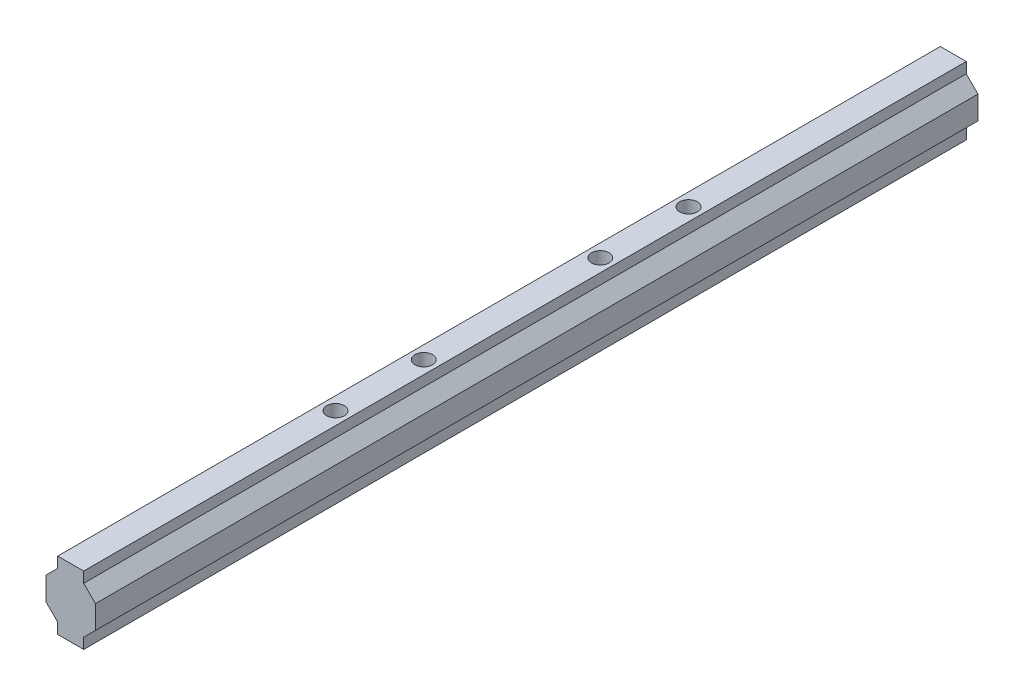
ISO-10303-21;
HEADER;
FILE_DESCRIPTION(('STEP AP214'),'2;1');
FILE_NAME('part.step','',(''),(''),'','','');
FILE_SCHEMA(('AUTOMOTIVE_DESIGN { 1 0 10303 214 1 1 1 1 }'));
ENDSEC;
DATA;
#1=APPLICATION_CONTEXT('core data for automotive mechanical design processes');
#2=APPLICATION_PROTOCOL_DEFINITION('international standard','automotive_design',2000,#1);
#3=PRODUCT_CONTEXT('',#1,'mechanical');
#4=PRODUCT('Part','Part','',(#3));
#5=PRODUCT_RELATED_PRODUCT_CATEGORY('part','',(#4));
#6=PRODUCT_DEFINITION_FORMATION('','',#4);
#7=PRODUCT_DEFINITION_CONTEXT('part definition',#1,'design');
#8=PRODUCT_DEFINITION('design','',#6,#7);
#9=PRODUCT_DEFINITION_SHAPE('','',#8);
#10=(LENGTH_UNIT() NAMED_UNIT(*) SI_UNIT(.MILLI.,.METRE.));
#11=(NAMED_UNIT(*) PLANE_ANGLE_UNIT() SI_UNIT($,.RADIAN.));
#12=(NAMED_UNIT(*) SI_UNIT($,.STERADIAN.) SOLID_ANGLE_UNIT());
#13=UNCERTAINTY_MEASURE_WITH_UNIT(LENGTH_MEASURE(1.E-05),#10,'distance_accuracy_value','');
#14=(GEOMETRIC_REPRESENTATION_CONTEXT(3) GLOBAL_UNCERTAINTY_ASSIGNED_CONTEXT((#13)) GLOBAL_UNIT_ASSIGNED_CONTEXT((#10,
#11,#12)) REPRESENTATION_CONTEXT('',''));
#15=CARTESIAN_POINT('',(0.,0.,0.));
#16=DIRECTION('',(0.,0.,1.));
#17=DIRECTION('',(1.,0.,0.));
#18=AXIS2_PLACEMENT_3D('',#15,#16,#17);
#19=CARTESIAN_POINT('',(-39.550290087148,0.0297695452971111,316.106580091162));
#20=DIRECTION('',(1.,0.,0.));
#21=DIRECTION('',(0.,0.,-1.));
#22=AXIS2_PLACEMENT_3D('',#19,#20,#21);
#23=PLANE('',#22);
#24=DIRECTION('',(0.,-1.,0.));
#25=VECTOR('',#24,1.);
#26=CARTESIAN_POINT('',(-39.550290087148,0.0297695452971111,116.106580091162));
#27=LINE('',#26,#25);
#28=CARTESIAN_POINT('',(-39.550290087148,5.29423563936438,116.106580091162));
#29=VERTEX_POINT('',#28);
#30=CARTESIAN_POINT('',(-39.550290087148,0.0297695452971111,116.106580091162));
#31=VERTEX_POINT('',#30);
#32=EDGE_CURVE('E155',#29,#31,#27,.T.);
#33=ORIENTED_EDGE('',*,*,#32,.T.);
#34=DIRECTION('',(0.,0.,-1.));
#35=VECTOR('',#34,1.);
#36=CARTESIAN_POINT('',(-39.550290087148,0.0297695452971111,316.106580091162));
#37=LINE('',#36,#35);
#38=CARTESIAN_POINT('',(-39.550290087148,0.0297695452971111,316.106580091162));
#39=VERTEX_POINT('',#38);
#40=EDGE_CURVE('E11',#39,#31,#37,.T.);
#41=ORIENTED_EDGE('',*,*,#40,.F.);
#42=DIRECTION('',(0.,-1.,0.));
#43=VECTOR('',#42,1.);
#44=CARTESIAN_POINT('',(-39.550290087148,0.0297695452971111,316.106580091162));
#45=LINE('',#44,#43);
#46=CARTESIAN_POINT('',(-39.550290087148,5.29423563936438,316.106580091162));
#47=VERTEX_POINT('',#46);
#48=EDGE_CURVE('E177',#47,#39,#45,.T.);
#49=ORIENTED_EDGE('',*,*,#48,.F.);
#50=DIRECTION('',(0.,0.,-1.));
#51=VECTOR('',#50,1.);
#52=CARTESIAN_POINT('',(-39.550290087148,5.29423563936438,316.106580091162));
#53=LINE('',#52,#51);
#54=EDGE_CURVE('E151',#47,#29,#53,.T.);
#55=ORIENTED_EDGE('',*,*,#54,.T.);
#56=EDGE_LOOP('',(#33,#41,#49,#55));
#57=FACE_BOUND('',#56,.T.);
#58=ADVANCED_FACE('F33',(#57),#23,.F.);
#59=CARTESIAN_POINT('',(-36.8896299153682,-2.63089062648271,316.106580091162));
#60=DIRECTION('',(0.707106781186547,0.707106781186547,0.));
#61=DIRECTION('',(-0.707106781186548,0.707106781186548,0.));
#62=AXIS2_PLACEMENT_3D('',#59,#60,#61);
#63=PLANE('',#62);
#64=DIRECTION('',(0.707106781186547,-0.707106781186547,0.));
#65=VECTOR('',#64,1.);
#66=CARTESIAN_POINT('',(-36.8896299153682,-2.63089062648271,116.106580091162));
#67=LINE('',#66,#65);
#68=CARTESIAN_POINT('',(-36.8896299153682,-2.63089062648271,116.106580091162));
#69=VERTEX_POINT('',#68);
#70=EDGE_CURVE('E158',#31,#69,#67,.T.);
#71=ORIENTED_EDGE('',*,*,#70,.T.);
#72=DIRECTION('',(0.,0.,-1.));
#73=VECTOR('',#72,1.);
#74=CARTESIAN_POINT('',(-36.8896299153682,-2.63089062648271,316.106580091162));
#75=LINE('',#74,#73);
#76=CARTESIAN_POINT('',(-36.8896299153682,-2.63089062648271,316.106580091162));
#77=VERTEX_POINT('',#76);
#78=EDGE_CURVE('E42',#77,#69,#75,.T.);
#79=ORIENTED_EDGE('',*,*,#78,.F.);
#80=DIRECTION('',(0.707106781186547,-0.707106781186547,0.));
#81=VECTOR('',#80,1.);
#82=CARTESIAN_POINT('',(-36.8896299153682,-2.63089062648271,316.106580091162));
#83=LINE('',#82,#81);
#84=EDGE_CURVE('E106',#39,#77,#83,.T.);
#85=ORIENTED_EDGE('',*,*,#84,.F.);
#86=ORIENTED_EDGE('',*,*,#40,.T.);
#87=EDGE_LOOP('',(#71,#79,#85,#86));
#88=FACE_BOUND('',#87,.T.);
#89=ADVANCED_FACE('F228',(#88),#63,.F.);
#90=CARTESIAN_POINT('',(-36.8896299153682,-5.03799740766926,316.106580091162));
#91=DIRECTION('',(1.,0.,0.));
#92=DIRECTION('',(0.,0.,-1.));
#93=AXIS2_PLACEMENT_3D('',#90,#91,#92);
#94=PLANE('',#93);
#95=DIRECTION('',(0.,-1.,0.));
#96=VECTOR('',#95,1.);
#97=CARTESIAN_POINT('',(-36.8896299153682,-5.03799740766926,116.106580091162));
#98=LINE('',#97,#96);
#99=CARTESIAN_POINT('',(-36.8896299153682,-5.03799740766926,116.106580091162));
#100=VERTEX_POINT('',#99);
#101=EDGE_CURVE('E160',#69,#100,#98,.T.);
#102=ORIENTED_EDGE('',*,*,#101,.T.);
#103=DIRECTION('',(0.,0.,-1.));
#104=VECTOR('',#103,1.);
#105=CARTESIAN_POINT('',(-36.8896299153682,-5.03799740766926,316.106580091162));
#106=LINE('',#105,#104);
#107=CARTESIAN_POINT('',(-36.8896299153682,-5.03799740766926,316.106580091162));
#108=VERTEX_POINT('',#107);
#109=EDGE_CURVE('E196',#108,#100,#106,.T.);
#110=ORIENTED_EDGE('',*,*,#109,.F.);
#111=DIRECTION('',(0.,-1.,0.));
#112=VECTOR('',#111,1.);
#113=CARTESIAN_POINT('',(-36.8896299153682,-5.03799740766926,316.106580091162));
#114=LINE('',#113,#112);
#115=EDGE_CURVE('E244',#77,#108,#114,.T.);
#116=ORIENTED_EDGE('',*,*,#115,.F.);
#117=ORIENTED_EDGE('',*,*,#78,.T.);
#118=EDGE_LOOP('',(#102,#110,#116,#117));
#119=FACE_BOUND('',#118,.T.);
#120=ADVANCED_FACE('F233',(#119),#94,.F.);
#121=CARTESIAN_POINT('',(-31.0109502589278,-5.03799740766925,316.106580091162));
#122=DIRECTION('',(0.,1.,0.));
#123=DIRECTION('',(-1.,0.,0.));
#124=AXIS2_PLACEMENT_3D('',#121,#122,#123);
#125=PLANE('',#124);
#126=CARTESIAN_POINT('',(-33.950290087148,-5.03799740766926,176.106580091162));
#127=DIRECTION('',(0.,-1.,0.));
#128=DIRECTION('',(1.,0.,0.));
#129=AXIS2_PLACEMENT_3D('',#126,#127,#128);
#130=CIRCLE('',#129,2.);
#131=CARTESIAN_POINT('',(-31.950290087148,-5.03799740766926,176.106580091162));
#132=VERTEX_POINT('',#131);
#133=EDGE_CURVE('E205',#132,#132,#130,.T.);
#134=ORIENTED_EDGE('',*,*,#133,.F.);
#135=EDGE_LOOP('',(#134));
#136=FACE_BOUND('',#135,.T.);
#137=CARTESIAN_POINT('',(-33.950290087148,-5.03799740766926,196.106580091162));
#138=DIRECTION('',(0.,-1.,0.));
#139=DIRECTION('',(1.,0.,0.));
#140=AXIS2_PLACEMENT_3D('',#137,#138,#139);
#141=CIRCLE('',#140,2.);
#142=CARTESIAN_POINT('',(-31.950290087148,-5.03799740766926,196.106580091162));
#143=VERTEX_POINT('',#142);
#144=EDGE_CURVE('E334',#143,#143,#141,.T.);
#145=ORIENTED_EDGE('',*,*,#144,.F.);
#146=EDGE_LOOP('',(#145));
#147=FACE_BOUND('',#146,.T.);
#148=CARTESIAN_POINT('',(-33.950290087148,-5.03799740766926,236.106580091162));
#149=DIRECTION('',(0.,-1.,0.));
#150=DIRECTION('',(-1.,0.,0.));
#151=AXIS2_PLACEMENT_3D('',#148,#149,#150);
#152=CIRCLE('',#151,2.);
#153=CARTESIAN_POINT('',(-35.950290087148,-5.03799740766926,236.106580091162));
#154=VERTEX_POINT('',#153);
#155=EDGE_CURVE('E327',#154,#154,#152,.T.);
#156=ORIENTED_EDGE('',*,*,#155,.F.);
#157=EDGE_LOOP('',(#156));
#158=FACE_BOUND('',#157,.T.);
#159=CARTESIAN_POINT('',(-33.950290087148,-5.03799740766926,256.106580091162));
#160=DIRECTION('',(0.,-1.,0.));
#161=DIRECTION('',(-1.,0.,0.));
#162=AXIS2_PLACEMENT_3D('',#159,#160,#161);
#163=CIRCLE('',#162,2.);
#164=CARTESIAN_POINT('',(-35.950290087148,-5.03799740766926,256.106580091162));
#165=VERTEX_POINT('',#164);
#166=EDGE_CURVE('E335',#165,#165,#163,.T.);
#167=ORIENTED_EDGE('',*,*,#166,.F.);
#168=EDGE_LOOP('',(#167));
#169=FACE_BOUND('',#168,.T.);
#170=DIRECTION('',(1.,0.,0.));
#171=VECTOR('',#170,1.);
#172=CARTESIAN_POINT('',(-31.0109502589278,-5.03799740766925,116.106580091162));
#173=LINE('',#172,#171);
#174=CARTESIAN_POINT('',(-31.0109502589278,-5.03799740766925,116.106580091162));
#175=VERTEX_POINT('',#174);
#176=EDGE_CURVE('E162',#100,#175,#173,.T.);
#177=ORIENTED_EDGE('',*,*,#176,.T.);
#178=DIRECTION('',(0.,0.,-1.));
#179=VECTOR('',#178,1.);
#180=CARTESIAN_POINT('',(-31.0109502589278,-5.03799740766925,316.106580091162));
#181=LINE('',#180,#179);
#182=CARTESIAN_POINT('',(-31.0109502589278,-5.03799740766925,316.106580091162));
#183=VERTEX_POINT('',#182);
#184=EDGE_CURVE('E193',#183,#175,#181,.T.);
#185=ORIENTED_EDGE('',*,*,#184,.F.);
#186=DIRECTION('',(1.,0.,0.));
#187=VECTOR('',#186,1.);
#188=CARTESIAN_POINT('',(-31.0109502589278,-5.03799740766925,316.106580091162));
#189=LINE('',#188,#187);
#190=EDGE_CURVE('E246',#108,#183,#189,.T.);
#191=ORIENTED_EDGE('',*,*,#190,.F.);
#192=ORIENTED_EDGE('',*,*,#109,.T.);
#193=EDGE_LOOP('',(#177,#185,#191,#192));
#194=FACE_BOUND('',#193,.T.);
#195=ADVANCED_FACE('F284',(#136,#147,#158,#169,#194),#125,.F.);
#196=CARTESIAN_POINT('',(-31.0109502589278,-2.63089062648273,316.106580091162));
#197=DIRECTION('',(-1.,0.,0.));
#198=DIRECTION('',(0.,0.,1.));
#199=AXIS2_PLACEMENT_3D('',#196,#197,#198);
#200=PLANE('',#199);
#201=DIRECTION('',(0.,1.,0.));
#202=VECTOR('',#201,1.);
#203=CARTESIAN_POINT('',(-31.0109502589278,-2.63089062648273,116.106580091162));
#204=LINE('',#203,#202);
#205=CARTESIAN_POINT('',(-31.0109502589278,-2.63089062648273,116.106580091162));
#206=VERTEX_POINT('',#205);
#207=EDGE_CURVE('E164',#175,#206,#204,.T.);
#208=ORIENTED_EDGE('',*,*,#207,.T.);
#209=DIRECTION('',(0.,0.,-1.));
#210=VECTOR('',#209,1.);
#211=CARTESIAN_POINT('',(-31.0109502589278,-2.63089062648273,316.106580091162));
#212=LINE('',#211,#210);
#213=CARTESIAN_POINT('',(-31.0109502589278,-2.63089062648273,316.106580091162));
#214=VERTEX_POINT('',#213);
#215=EDGE_CURVE('E190',#214,#206,#212,.T.);
#216=ORIENTED_EDGE('',*,*,#215,.F.);
#217=DIRECTION('',(0.,1.,0.));
#218=VECTOR('',#217,1.);
#219=CARTESIAN_POINT('',(-31.0109502589278,-2.63089062648273,316.106580091162));
#220=LINE('',#219,#218);
#221=EDGE_CURVE('E248',#183,#214,#220,.T.);
#222=ORIENTED_EDGE('',*,*,#221,.F.);
#223=ORIENTED_EDGE('',*,*,#184,.T.);
#224=EDGE_LOOP('',(#208,#216,#222,#223));
#225=FACE_BOUND('',#224,.T.);
#226=ADVANCED_FACE('F281',(#225),#200,.F.);
#227=CARTESIAN_POINT('',(-28.350290087148,0.0297695452971137,316.106580091162));
#228=DIRECTION('',(-0.707106781186548,0.707106781186548,0.));
#229=DIRECTION('',(-0.707106781186548,-0.707106781186548,0.));
#230=AXIS2_PLACEMENT_3D('',#227,#228,#229);
#231=PLANE('',#230);
#232=DIRECTION('',(0.707106781186548,0.707106781186548,0.));
#233=VECTOR('',#232,1.);
#234=CARTESIAN_POINT('',(-28.350290087148,0.0297695452971137,116.106580091162));
#235=LINE('',#234,#233);
#236=CARTESIAN_POINT('',(-28.350290087148,0.0297695452971137,116.106580091162));
#237=VERTEX_POINT('',#236);
#238=EDGE_CURVE('E166',#206,#237,#235,.T.);
#239=ORIENTED_EDGE('',*,*,#238,.T.);
#240=DIRECTION('',(0.,0.,-1.));
#241=VECTOR('',#240,1.);
#242=CARTESIAN_POINT('',(-28.350290087148,0.0297695452971137,316.106580091162));
#243=LINE('',#242,#241);
#244=CARTESIAN_POINT('',(-28.350290087148,0.0297695452971137,316.106580091162));
#245=VERTEX_POINT('',#244);
#246=EDGE_CURVE('E187',#245,#237,#243,.T.);
#247=ORIENTED_EDGE('',*,*,#246,.F.);
#248=DIRECTION('',(0.707106781186548,0.707106781186548,0.));
#249=VECTOR('',#248,1.);
#250=CARTESIAN_POINT('',(-28.350290087148,0.0297695452971137,316.106580091162));
#251=LINE('',#250,#249);
#252=EDGE_CURVE('E254',#214,#245,#251,.T.);
#253=ORIENTED_EDGE('',*,*,#252,.F.);
#254=ORIENTED_EDGE('',*,*,#215,.T.);
#255=EDGE_LOOP('',(#239,#247,#253,#254));
#256=FACE_BOUND('',#255,.T.);
#257=ADVANCED_FACE('F277',(#256),#231,.F.);
#258=CARTESIAN_POINT('',(-28.350290087148,5.29423563936437,316.106580091162));
#259=DIRECTION('',(-1.,0.,0.));
#260=DIRECTION('',(0.,0.,1.));
#261=AXIS2_PLACEMENT_3D('',#258,#259,#260);
#262=PLANE('',#261);
#263=DIRECTION('',(0.,1.,0.));
#264=VECTOR('',#263,1.);
#265=CARTESIAN_POINT('',(-28.350290087148,5.29423563936437,116.106580091162));
#266=LINE('',#265,#264);
#267=CARTESIAN_POINT('',(-28.350290087148,5.29423563936437,116.106580091162));
#268=VERTEX_POINT('',#267);
#269=EDGE_CURVE('E168',#237,#268,#266,.T.);
#270=ORIENTED_EDGE('',*,*,#269,.T.);
#271=DIRECTION('',(0.,0.,-1.));
#272=VECTOR('',#271,1.);
#273=CARTESIAN_POINT('',(-28.350290087148,5.29423563936437,316.106580091162));
#274=LINE('',#273,#272);
#275=CARTESIAN_POINT('',(-28.350290087148,5.29423563936437,316.106580091162));
#276=VERTEX_POINT('',#275);
#277=EDGE_CURVE('E184',#276,#268,#274,.T.);
#278=ORIENTED_EDGE('',*,*,#277,.F.);
#279=DIRECTION('',(0.,1.,0.));
#280=VECTOR('',#279,1.);
#281=CARTESIAN_POINT('',(-28.350290087148,5.29423563936437,316.106580091162));
#282=LINE('',#281,#280);
#283=EDGE_CURVE('E256',#245,#276,#282,.T.);
#284=ORIENTED_EDGE('',*,*,#283,.F.);
#285=ORIENTED_EDGE('',*,*,#246,.T.);
#286=EDGE_LOOP('',(#270,#278,#284,#285));
#287=FACE_BOUND('',#286,.T.);
#288=ADVANCED_FACE('F273',(#287),#262,.F.);
#289=CARTESIAN_POINT('',(-31.0109502589278,7.95489581114419,316.106580091162));
#290=DIRECTION('',(-0.707106781186547,-0.707106781186547,0.));
#291=DIRECTION('',(0.707106781186548,-0.707106781186548,0.));
#292=AXIS2_PLACEMENT_3D('',#289,#290,#291);
#293=PLANE('',#292);
#294=DIRECTION('',(-0.707106781186547,0.707106781186547,0.));
#295=VECTOR('',#294,1.);
#296=CARTESIAN_POINT('',(-31.0109502589278,7.95489581114419,116.106580091162));
#297=LINE('',#296,#295);
#298=CARTESIAN_POINT('',(-31.0109502589278,7.95489581114419,116.106580091162));
#299=VERTEX_POINT('',#298);
#300=EDGE_CURVE('E170',#268,#299,#297,.T.);
#301=ORIENTED_EDGE('',*,*,#300,.T.);
#302=DIRECTION('',(0.,0.,-1.));
#303=VECTOR('',#302,1.);
#304=CARTESIAN_POINT('',(-31.0109502589278,7.95489581114419,316.106580091162));
#305=LINE('',#304,#303);
#306=CARTESIAN_POINT('',(-31.0109502589278,7.95489581114419,316.106580091162));
#307=VERTEX_POINT('',#306);
#308=EDGE_CURVE('E181',#307,#299,#305,.T.);
#309=ORIENTED_EDGE('',*,*,#308,.F.);
#310=DIRECTION('',(-0.707106781186547,0.707106781186547,0.));
#311=VECTOR('',#310,1.);
#312=CARTESIAN_POINT('',(-31.0109502589278,7.95489581114419,316.106580091162));
#313=LINE('',#312,#311);
#314=EDGE_CURVE('E258',#276,#307,#313,.T.);
#315=ORIENTED_EDGE('',*,*,#314,.F.);
#316=ORIENTED_EDGE('',*,*,#277,.T.);
#317=EDGE_LOOP('',(#301,#309,#315,#316));
#318=FACE_BOUND('',#317,.T.);
#319=ADVANCED_FACE('F264',(#318),#293,.F.);
#320=CARTESIAN_POINT('',(-31.0109502589278,10.3620025923307,316.106580091162));
#321=DIRECTION('',(-1.,0.,0.));
#322=DIRECTION('',(0.,0.,1.));
#323=AXIS2_PLACEMENT_3D('',#320,#321,#322);
#324=PLANE('',#323);
#325=DIRECTION('',(0.,1.,0.));
#326=VECTOR('',#325,1.);
#327=CARTESIAN_POINT('',(-31.0109502589278,10.3620025923307,116.106580091162));
#328=LINE('',#327,#326);
#329=CARTESIAN_POINT('',(-31.0109502589278,10.3620025923307,116.106580091162));
#330=VERTEX_POINT('',#329);
#331=EDGE_CURVE('E172',#299,#330,#328,.T.);
#332=ORIENTED_EDGE('',*,*,#331,.T.);
#333=DIRECTION('',(0.,0.,-1.));
#334=VECTOR('',#333,1.);
#335=CARTESIAN_POINT('',(-31.0109502589278,10.3620025923307,316.106580091162));
#336=LINE('',#335,#334);
#337=CARTESIAN_POINT('',(-31.0109502589278,10.3620025923307,316.106580091162));
#338=VERTEX_POINT('',#337);
#339=EDGE_CURVE('E146',#338,#330,#336,.T.);
#340=ORIENTED_EDGE('',*,*,#339,.F.);
#341=DIRECTION('',(0.,1.,0.));
#342=VECTOR('',#341,1.);
#343=CARTESIAN_POINT('',(-31.0109502589278,10.3620025923307,316.106580091162));
#344=LINE('',#343,#342);
#345=EDGE_CURVE('E137',#307,#338,#344,.T.);
#346=ORIENTED_EDGE('',*,*,#345,.F.);
#347=ORIENTED_EDGE('',*,*,#308,.T.);
#348=EDGE_LOOP('',(#332,#340,#346,#347));
#349=FACE_BOUND('',#348,.T.);
#350=ADVANCED_FACE('F268',(#349),#324,.F.);
#351=CARTESIAN_POINT('',(-36.8896299153682,10.3620025923307,316.106580091162));
#352=DIRECTION('',(0.,-1.,0.));
#353=DIRECTION('',(0.,0.,-1.));
#354=AXIS2_PLACEMENT_3D('',#351,#352,#353);
#355=PLANE('',#354);
#356=CARTESIAN_POINT('',(-33.950290087148,10.3620025923307,176.106580091162));
#357=DIRECTION('',(0.,-1.,0.));
#358=DIRECTION('',(0.,0.,-1.));
#359=AXIS2_PLACEMENT_3D('',#356,#357,#358);
#360=CIRCLE('',#359,2.);
#361=CARTESIAN_POINT('',(-33.950290087148,10.3620025923307,174.106580091162));
#362=VERTEX_POINT('',#361);
#363=EDGE_CURVE('E36',#362,#362,#360,.T.);
#364=ORIENTED_EDGE('',*,*,#363,.T.);
#365=EDGE_LOOP('',(#364));
#366=FACE_BOUND('',#365,.T.);
#367=CARTESIAN_POINT('',(-33.950290087148,10.3620025923307,196.106580091162));
#368=DIRECTION('',(0.,-1.,0.));
#369=DIRECTION('',(0.,0.,-1.));
#370=AXIS2_PLACEMENT_3D('',#367,#368,#369);
#371=CIRCLE('',#370,2.);
#372=CARTESIAN_POINT('',(-33.950290087148,10.3620025923307,194.106580091162));
#373=VERTEX_POINT('',#372);
#374=EDGE_CURVE('E207',#373,#373,#371,.T.);
#375=ORIENTED_EDGE('',*,*,#374,.T.);
#376=EDGE_LOOP('',(#375));
#377=FACE_BOUND('',#376,.T.);
#378=CARTESIAN_POINT('',(-33.950290087148,10.3620025923307,236.106580091162));
#379=DIRECTION('',(0.,-1.,0.));
#380=DIRECTION('',(0.,0.,-1.));
#381=AXIS2_PLACEMENT_3D('',#378,#379,#380);
#382=CIRCLE('',#381,2.);
#383=CARTESIAN_POINT('',(-33.950290087148,10.3620025923307,234.106580091162));
#384=VERTEX_POINT('',#383);
#385=EDGE_CURVE('E204',#384,#384,#382,.T.);
#386=ORIENTED_EDGE('',*,*,#385,.T.);
#387=EDGE_LOOP('',(#386));
#388=FACE_BOUND('',#387,.T.);
#389=CARTESIAN_POINT('',(-33.950290087148,10.3620025923307,256.106580091162));
#390=DIRECTION('',(0.,-1.,0.));
#391=DIRECTION('',(0.,0.,-1.));
#392=AXIS2_PLACEMENT_3D('',#389,#390,#391);
#393=CIRCLE('',#392,2.);
#394=CARTESIAN_POINT('',(-33.950290087148,10.3620025923307,254.106580091162));
#395=VERTEX_POINT('',#394);
#396=EDGE_CURVE('E201',#395,#395,#393,.T.);
#397=ORIENTED_EDGE('',*,*,#396,.T.);
#398=EDGE_LOOP('',(#397));
#399=FACE_BOUND('',#398,.T.);
#400=DIRECTION('',(-1.,0.,0.));
#401=VECTOR('',#400,1.);
#402=CARTESIAN_POINT('',(-36.8896299153682,10.3620025923307,116.106580091162));
#403=LINE('',#402,#401);
#404=CARTESIAN_POINT('',(-36.8896299153682,10.3620025923307,116.106580091162));
#405=VERTEX_POINT('',#404);
#406=EDGE_CURVE('E145',#330,#405,#403,.T.);
#407=ORIENTED_EDGE('',*,*,#406,.T.);
#408=DIRECTION('',(0.,0.,-1.));
#409=VECTOR('',#408,1.);
#410=CARTESIAN_POINT('',(-36.8896299153682,10.3620025923307,316.106580091162));
#411=LINE('',#410,#409);
#412=CARTESIAN_POINT('',(-36.8896299153682,10.3620025923307,316.106580091162));
#413=VERTEX_POINT('',#412);
#414=EDGE_CURVE('E142',#413,#405,#411,.T.);
#415=ORIENTED_EDGE('',*,*,#414,.F.);
#416=DIRECTION('',(-1.,0.,0.));
#417=VECTOR('',#416,1.);
#418=CARTESIAN_POINT('',(-36.8896299153682,10.3620025923307,316.106580091162));
#419=LINE('',#418,#417);
#420=EDGE_CURVE('E131',#338,#413,#419,.T.);
#421=ORIENTED_EDGE('',*,*,#420,.F.);
#422=ORIENTED_EDGE('',*,*,#339,.T.);
#423=EDGE_LOOP('',(#407,#415,#421,#422));
#424=FACE_BOUND('',#423,.T.);
#425=ADVANCED_FACE('F143',(#366,#377,#388,#399,#424),#355,.F.);
#426=CARTESIAN_POINT('',(-36.8896299153682,7.9548958111442,316.106580091162));
#427=DIRECTION('',(1.,0.,0.));
#428=DIRECTION('',(0.,0.,-1.));
#429=AXIS2_PLACEMENT_3D('',#426,#427,#428);
#430=PLANE('',#429);
#431=DIRECTION('',(0.,-1.,0.));
#432=VECTOR('',#431,1.);
#433=CARTESIAN_POINT('',(-36.8896299153682,7.9548958111442,116.106580091162));
#434=LINE('',#433,#432);
#435=CARTESIAN_POINT('',(-36.8896299153682,7.9548958111442,116.106580091162));
#436=VERTEX_POINT('',#435);
#437=EDGE_CURVE('E92',#405,#436,#434,.T.);
#438=ORIENTED_EDGE('',*,*,#437,.T.);
#439=DIRECTION('',(0.,0.,-1.));
#440=VECTOR('',#439,1.);
#441=CARTESIAN_POINT('',(-36.8896299153682,7.9548958111442,316.106580091162));
#442=LINE('',#441,#440);
#443=CARTESIAN_POINT('',(-36.8896299153682,7.9548958111442,316.106580091162));
#444=VERTEX_POINT('',#443);
#445=EDGE_CURVE('E147',#444,#436,#442,.T.);
#446=ORIENTED_EDGE('',*,*,#445,.F.);
#447=DIRECTION('',(0.,-1.,0.));
#448=VECTOR('',#447,1.);
#449=CARTESIAN_POINT('',(-36.8896299153682,7.9548958111442,316.106580091162));
#450=LINE('',#449,#448);
#451=EDGE_CURVE('E135',#413,#444,#450,.T.);
#452=ORIENTED_EDGE('',*,*,#451,.F.);
#453=ORIENTED_EDGE('',*,*,#414,.T.);
#454=EDGE_LOOP('',(#438,#446,#452,#453));
#455=FACE_BOUND('',#454,.T.);
#456=ADVANCED_FACE('F149',(#455),#430,.F.);
#457=CARTESIAN_POINT('',(-39.550290087148,5.29423563936438,316.106580091162));
#458=DIRECTION('',(0.707106781186547,-0.707106781186547,0.));
#459=DIRECTION('',(0.707106781186548,0.707106781186548,0.));
#460=AXIS2_PLACEMENT_3D('',#457,#458,#459);
#461=PLANE('',#460);
#462=DIRECTION('',(-0.707106781186547,-0.707106781186547,0.));
#463=VECTOR('',#462,1.);
#464=CARTESIAN_POINT('',(-39.550290087148,5.29423563936438,116.106580091162));
#465=LINE('',#464,#463);
#466=EDGE_CURVE('E98',#436,#29,#465,.T.);
#467=ORIENTED_EDGE('',*,*,#466,.T.);
#468=ORIENTED_EDGE('',*,*,#54,.F.);
#469=DIRECTION('',(-0.707106781186547,-0.707106781186547,0.));
#470=VECTOR('',#469,1.);
#471=CARTESIAN_POINT('',(-39.550290087148,5.29423563936438,316.106580091162));
#472=LINE('',#471,#470);
#473=EDGE_CURVE('E51',#444,#47,#472,.T.);
#474=ORIENTED_EDGE('',*,*,#473,.F.);
#475=ORIENTED_EDGE('',*,*,#445,.T.);
#476=EDGE_LOOP('',(#467,#468,#474,#475));
#477=FACE_BOUND('',#476,.T.);
#478=ADVANCED_FACE('F309',(#477),#461,.F.);
#479=CARTESIAN_POINT('',(0.,0.,316.106580091162));
#480=DIRECTION('',(0.,0.,-1.));
#481=DIRECTION('',(-1.,0.,0.));
#482=AXIS2_PLACEMENT_3D('',#479,#480,#481);
#483=PLANE('',#482);
#484=ORIENTED_EDGE('',*,*,#48,.T.);
#485=ORIENTED_EDGE('',*,*,#84,.T.);
#486=ORIENTED_EDGE('',*,*,#115,.T.);
#487=ORIENTED_EDGE('',*,*,#190,.T.);
#488=ORIENTED_EDGE('',*,*,#221,.T.);
#489=ORIENTED_EDGE('',*,*,#252,.T.);
#490=ORIENTED_EDGE('',*,*,#283,.T.);
#491=ORIENTED_EDGE('',*,*,#314,.T.);
#492=ORIENTED_EDGE('',*,*,#345,.T.);
#493=ORIENTED_EDGE('',*,*,#420,.T.);
#494=ORIENTED_EDGE('',*,*,#451,.T.);
#495=ORIENTED_EDGE('',*,*,#473,.T.);
#496=EDGE_LOOP('',(#484,#485,#486,#487,#488,#489,#490,#491,#492,#493,#494,#495));
#497=FACE_BOUND('',#496,.T.);
#498=ADVANCED_FACE('F133',(#497),#483,.F.);
#499=CARTESIAN_POINT('',(0.,0.,116.106580091162));
#500=DIRECTION('',(0.,0.,-1.));
#501=DIRECTION('',(-1.,0.,0.));
#502=AXIS2_PLACEMENT_3D('',#499,#500,#501);
#503=PLANE('',#502);
#504=ORIENTED_EDGE('',*,*,#32,.F.);
#505=ORIENTED_EDGE('',*,*,#466,.F.);
#506=ORIENTED_EDGE('',*,*,#437,.F.);
#507=ORIENTED_EDGE('',*,*,#406,.F.);
#508=ORIENTED_EDGE('',*,*,#331,.F.);
#509=ORIENTED_EDGE('',*,*,#300,.F.);
#510=ORIENTED_EDGE('',*,*,#269,.F.);
#511=ORIENTED_EDGE('',*,*,#238,.F.);
#512=ORIENTED_EDGE('',*,*,#207,.F.);
#513=ORIENTED_EDGE('',*,*,#176,.F.);
#514=ORIENTED_EDGE('',*,*,#101,.F.);
#515=ORIENTED_EDGE('',*,*,#70,.F.);
#516=EDGE_LOOP('',(#504,#505,#506,#507,#508,#509,#510,#511,#512,#513,#514,#515));
#517=FACE_BOUND('',#516,.T.);
#518=ADVANCED_FACE('F238',(#517),#503,.T.);
#519=CARTESIAN_POINT('',(-33.950290087148,34.9620025923307,256.106580091162));
#520=DIRECTION('',(0.,-1.,0.));
#521=DIRECTION('',(1.,0.,0.));
#522=AXIS2_PLACEMENT_3D('',#519,#520,#521);
#523=CYLINDRICAL_SURFACE('',#522,2.);
#524=ORIENTED_EDGE('',*,*,#166,.T.);
#525=EDGE_LOOP('',(#524));
#526=FACE_BOUND('',#525,.T.);
#527=ORIENTED_EDGE('',*,*,#396,.F.);
#528=EDGE_LOOP('',(#527));
#529=FACE_BOUND('',#528,.T.);
#530=ADVANCED_FACE('F314',(#526,#529),#523,.F.);
#531=CARTESIAN_POINT('',(-33.950290087148,34.9620025923307,236.106580091162));
#532=DIRECTION('',(0.,-1.,0.));
#533=DIRECTION('',(1.,0.,0.));
#534=AXIS2_PLACEMENT_3D('',#531,#532,#533);
#535=CYLINDRICAL_SURFACE('',#534,2.);
#536=ORIENTED_EDGE('',*,*,#155,.T.);
#537=EDGE_LOOP('',(#536));
#538=FACE_BOUND('',#537,.T.);
#539=ORIENTED_EDGE('',*,*,#385,.F.);
#540=EDGE_LOOP('',(#539));
#541=FACE_BOUND('',#540,.T.);
#542=ADVANCED_FACE('F223',(#538,#541),#535,.F.);
#543=CARTESIAN_POINT('',(-33.950290087148,34.9620025923307,196.106580091162));
#544=DIRECTION('',(0.,-1.,0.));
#545=DIRECTION('',(1.,0.,0.));
#546=AXIS2_PLACEMENT_3D('',#543,#544,#545);
#547=CYLINDRICAL_SURFACE('',#546,2.);
#548=ORIENTED_EDGE('',*,*,#144,.T.);
#549=EDGE_LOOP('',(#548));
#550=FACE_BOUND('',#549,.T.);
#551=ORIENTED_EDGE('',*,*,#374,.F.);
#552=EDGE_LOOP('',(#551));
#553=FACE_BOUND('',#552,.T.);
#554=ADVANCED_FACE('F217',(#550,#553),#547,.F.);
#555=CARTESIAN_POINT('',(-33.950290087148,34.9620025923307,176.106580091162));
#556=DIRECTION('',(0.,-1.,0.));
#557=DIRECTION('',(1.,0.,0.));
#558=AXIS2_PLACEMENT_3D('',#555,#556,#557);
#559=CYLINDRICAL_SURFACE('',#558,2.);
#560=ORIENTED_EDGE('',*,*,#133,.T.);
#561=EDGE_LOOP('',(#560));
#562=FACE_BOUND('',#561,.T.);
#563=ORIENTED_EDGE('',*,*,#363,.F.);
#564=EDGE_LOOP('',(#563));
#565=FACE_BOUND('',#564,.T.);
#566=ADVANCED_FACE('F215',(#562,#565),#559,.F.);
#567=CLOSED_SHELL('',(#58,#89,#120,#195,#226,#257,#288,#319,#350,#425,#456,#478,#498,#518,#530,
#542,#554,#566));
#568=MANIFOLD_SOLID_BREP('B2',#567);
#569=ADVANCED_BREP_SHAPE_REPRESENTATION('',(#18,#568),#14);
#570=SHAPE_DEFINITION_REPRESENTATION(#9,#569);
ENDSEC;
END-ISO-10303-21;
